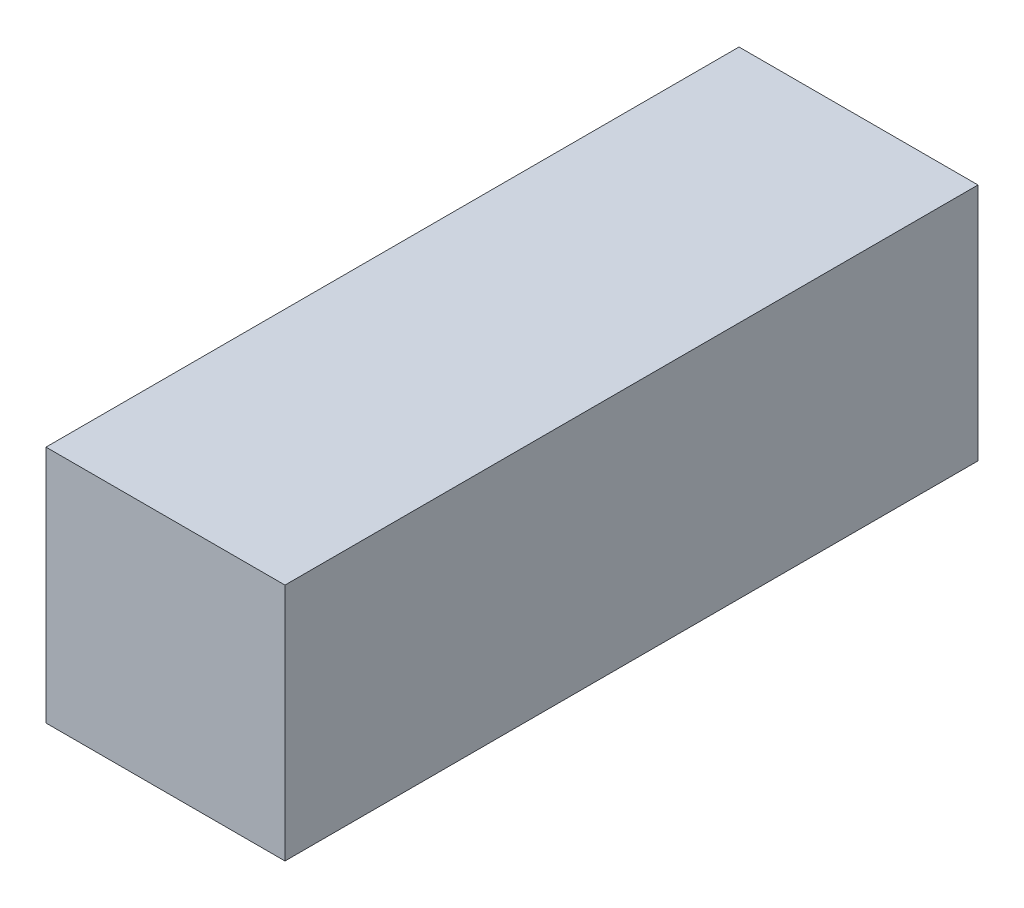
ISO-10303-21;
HEADER;
FILE_DESCRIPTION(('STEP AP214'),'2;1');
FILE_NAME('part.step','',(''),(''),'','','');
FILE_SCHEMA(('AUTOMOTIVE_DESIGN { 1 0 10303 214 1 1 1 1 }'));
ENDSEC;
DATA;
#1=APPLICATION_CONTEXT('core data for automotive mechanical design processes');
#2=APPLICATION_PROTOCOL_DEFINITION('international standard','automotive_design',2000,#1);
#3=PRODUCT_CONTEXT('',#1,'mechanical');
#4=PRODUCT('Part','Part','',(#3));
#5=PRODUCT_RELATED_PRODUCT_CATEGORY('part','',(#4));
#6=PRODUCT_DEFINITION_FORMATION('','',#4);
#7=PRODUCT_DEFINITION_CONTEXT('part definition',#1,'design');
#8=PRODUCT_DEFINITION('design','',#6,#7);
#9=PRODUCT_DEFINITION_SHAPE('','',#8);
#10=(LENGTH_UNIT() NAMED_UNIT(*) SI_UNIT(.MILLI.,.METRE.));
#11=(NAMED_UNIT(*) PLANE_ANGLE_UNIT() SI_UNIT($,.RADIAN.));
#12=(NAMED_UNIT(*) SI_UNIT($,.STERADIAN.) SOLID_ANGLE_UNIT());
#13=UNCERTAINTY_MEASURE_WITH_UNIT(LENGTH_MEASURE(1.E-05),#10,'distance_accuracy_value','');
#14=(GEOMETRIC_REPRESENTATION_CONTEXT(3) GLOBAL_UNCERTAINTY_ASSIGNED_CONTEXT((#13)) GLOBAL_UNIT_ASSIGNED_CONTEXT((#10,
#11,#12)) REPRESENTATION_CONTEXT('',''));
#15=CARTESIAN_POINT('',(0.,0.,0.));
#16=DIRECTION('',(0.,0.,1.));
#17=DIRECTION('',(1.,0.,0.));
#18=AXIS2_PLACEMENT_3D('',#15,#16,#17);
#19=CARTESIAN_POINT('',(0.,0.,58.));
#20=DIRECTION('',(1.,0.,0.));
#21=DIRECTION('',(0.,0.,-1.));
#22=AXIS2_PLACEMENT_3D('',#19,#20,#21);
#23=PLANE('',#22);
#24=DIRECTION('',(0.,-1.,0.));
#25=VECTOR('',#24,1.);
#26=CARTESIAN_POINT('',(0.,0.,0.));
#27=LINE('',#26,#25);
#28=CARTESIAN_POINT('',(0.,20.,0.));
#29=VERTEX_POINT('',#28);
#30=CARTESIAN_POINT('',(0.,0.,0.));
#31=VERTEX_POINT('',#30);
#32=EDGE_CURVE('E111',#29,#31,#27,.T.);
#33=ORIENTED_EDGE('',*,*,#32,.T.);
#34=DIRECTION('',(0.,0.,-1.));
#35=VECTOR('',#34,1.);
#36=CARTESIAN_POINT('',(0.,0.,58.));
#37=LINE('',#36,#35);
#38=CARTESIAN_POINT('',(0.,0.,58.));
#39=VERTEX_POINT('',#38);
#40=EDGE_CURVE('E11',#39,#31,#37,.T.);
#41=ORIENTED_EDGE('',*,*,#40,.F.);
#42=DIRECTION('',(0.,-1.,0.));
#43=VECTOR('',#42,1.);
#44=CARTESIAN_POINT('',(0.,0.,58.));
#45=LINE('',#44,#43);
#46=CARTESIAN_POINT('',(0.,20.,58.));
#47=VERTEX_POINT('',#46);
#48=EDGE_CURVE('E100',#47,#39,#45,.T.);
#49=ORIENTED_EDGE('',*,*,#48,.F.);
#50=DIRECTION('',(0.,0.,-1.));
#51=VECTOR('',#50,1.);
#52=CARTESIAN_POINT('',(0.,20.,58.));
#53=LINE('',#52,#51);
#54=EDGE_CURVE('E109',#47,#29,#53,.T.);
#55=ORIENTED_EDGE('',*,*,#54,.T.);
#56=EDGE_LOOP('',(#33,#41,#49,#55));
#57=FACE_BOUND('',#56,.T.);
#58=ADVANCED_FACE('F44',(#57),#23,.F.);
#59=CARTESIAN_POINT('',(0.,0.,58.));
#60=DIRECTION('',(0.,1.,0.));
#61=DIRECTION('',(0.,0.,1.));
#62=AXIS2_PLACEMENT_3D('',#59,#60,#61);
#63=PLANE('',#62);
#64=DIRECTION('',(1.,0.,0.));
#65=VECTOR('',#64,1.);
#66=CARTESIAN_POINT('',(0.,0.,0.));
#67=LINE('',#66,#65);
#68=CARTESIAN_POINT('',(20.,0.,0.));
#69=VERTEX_POINT('',#68);
#70=EDGE_CURVE('E105',#31,#69,#67,.T.);
#71=ORIENTED_EDGE('',*,*,#70,.T.);
#72=DIRECTION('',(0.,0.,-1.));
#73=VECTOR('',#72,1.);
#74=CARTESIAN_POINT('',(20.,0.,58.));
#75=LINE('',#74,#73);
#76=CARTESIAN_POINT('',(20.,0.,58.));
#77=VERTEX_POINT('',#76);
#78=EDGE_CURVE('E53',#77,#69,#75,.T.);
#79=ORIENTED_EDGE('',*,*,#78,.F.);
#80=DIRECTION('',(1.,0.,0.));
#81=VECTOR('',#80,1.);
#82=CARTESIAN_POINT('',(0.,0.,58.));
#83=LINE('',#82,#81);
#84=EDGE_CURVE('E95',#39,#77,#83,.T.);
#85=ORIENTED_EDGE('',*,*,#84,.F.);
#86=ORIENTED_EDGE('',*,*,#40,.T.);
#87=EDGE_LOOP('',(#71,#79,#85,#86));
#88=FACE_BOUND('',#87,.T.);
#89=ADVANCED_FACE('F101',(#88),#63,.F.);
#90=CARTESIAN_POINT('',(20.,0.,58.));
#91=DIRECTION('',(-1.,0.,0.));
#92=DIRECTION('',(0.,0.,1.));
#93=AXIS2_PLACEMENT_3D('',#90,#91,#92);
#94=PLANE('',#93);
#95=DIRECTION('',(0.,1.,0.));
#96=VECTOR('',#95,1.);
#97=CARTESIAN_POINT('',(20.,0.,0.));
#98=LINE('',#97,#96);
#99=CARTESIAN_POINT('',(20.,20.,0.));
#100=VERTEX_POINT('',#99);
#101=EDGE_CURVE('E80',#69,#100,#98,.T.);
#102=ORIENTED_EDGE('',*,*,#101,.T.);
#103=DIRECTION('',(0.,0.,-1.));
#104=VECTOR('',#103,1.);
#105=CARTESIAN_POINT('',(20.,20.,58.));
#106=LINE('',#105,#104);
#107=CARTESIAN_POINT('',(20.,20.,58.));
#108=VERTEX_POINT('',#107);
#109=EDGE_CURVE('E102',#108,#100,#106,.T.);
#110=ORIENTED_EDGE('',*,*,#109,.F.);
#111=DIRECTION('',(0.,1.,0.));
#112=VECTOR('',#111,1.);
#113=CARTESIAN_POINT('',(20.,0.,58.));
#114=LINE('',#113,#112);
#115=EDGE_CURVE('E92',#77,#108,#114,.T.);
#116=ORIENTED_EDGE('',*,*,#115,.F.);
#117=ORIENTED_EDGE('',*,*,#78,.T.);
#118=EDGE_LOOP('',(#102,#110,#116,#117));
#119=FACE_BOUND('',#118,.T.);
#120=ADVANCED_FACE('F104',(#119),#94,.F.);
#121=CARTESIAN_POINT('',(0.,20.,58.));
#122=DIRECTION('',(0.,-1.,0.));
#123=DIRECTION('',(0.,0.,-1.));
#124=AXIS2_PLACEMENT_3D('',#121,#122,#123);
#125=PLANE('',#124);
#126=DIRECTION('',(-1.,0.,0.));
#127=VECTOR('',#126,1.);
#128=CARTESIAN_POINT('',(0.,20.,0.));
#129=LINE('',#128,#127);
#130=EDGE_CURVE('E84',#100,#29,#129,.T.);
#131=ORIENTED_EDGE('',*,*,#130,.T.);
#132=ORIENTED_EDGE('',*,*,#54,.F.);
#133=DIRECTION('',(-1.,0.,0.));
#134=VECTOR('',#133,1.);
#135=CARTESIAN_POINT('',(0.,20.,58.));
#136=LINE('',#135,#134);
#137=EDGE_CURVE('E64',#108,#47,#136,.T.);
#138=ORIENTED_EDGE('',*,*,#137,.F.);
#139=ORIENTED_EDGE('',*,*,#109,.T.);
#140=EDGE_LOOP('',(#131,#132,#138,#139));
#141=FACE_BOUND('',#140,.T.);
#142=ADVANCED_FACE('F127',(#141),#125,.F.);
#143=CARTESIAN_POINT('',(0.,0.,58.));
#144=DIRECTION('',(0.,0.,-1.));
#145=DIRECTION('',(-1.,0.,0.));
#146=AXIS2_PLACEMENT_3D('',#143,#144,#145);
#147=PLANE('',#146);
#148=ORIENTED_EDGE('',*,*,#48,.T.);
#149=ORIENTED_EDGE('',*,*,#84,.T.);
#150=ORIENTED_EDGE('',*,*,#115,.T.);
#151=ORIENTED_EDGE('',*,*,#137,.T.);
#152=EDGE_LOOP('',(#148,#149,#150,#151));
#153=FACE_BOUND('',#152,.T.);
#154=ADVANCED_FACE('F91',(#153),#147,.F.);
#155=CARTESIAN_POINT('',(0.,0.,0.));
#156=DIRECTION('',(0.,0.,-1.));
#157=DIRECTION('',(-1.,0.,0.));
#158=AXIS2_PLACEMENT_3D('',#155,#156,#157);
#159=PLANE('',#158);
#160=ORIENTED_EDGE('',*,*,#32,.F.);
#161=ORIENTED_EDGE('',*,*,#130,.F.);
#162=ORIENTED_EDGE('',*,*,#101,.F.);
#163=ORIENTED_EDGE('',*,*,#70,.F.);
#164=EDGE_LOOP('',(#160,#161,#162,#163));
#165=FACE_BOUND('',#164,.T.);
#166=ADVANCED_FACE('F129',(#165),#159,.T.);
#167=CLOSED_SHELL('',(#58,#89,#120,#142,#154,#166));
#168=MANIFOLD_SOLID_BREP('B2',#167);
#169=ADVANCED_BREP_SHAPE_REPRESENTATION('',(#18,#168),#14);
#170=SHAPE_DEFINITION_REPRESENTATION(#9,#169);
ENDSEC;
END-ISO-10303-21;
